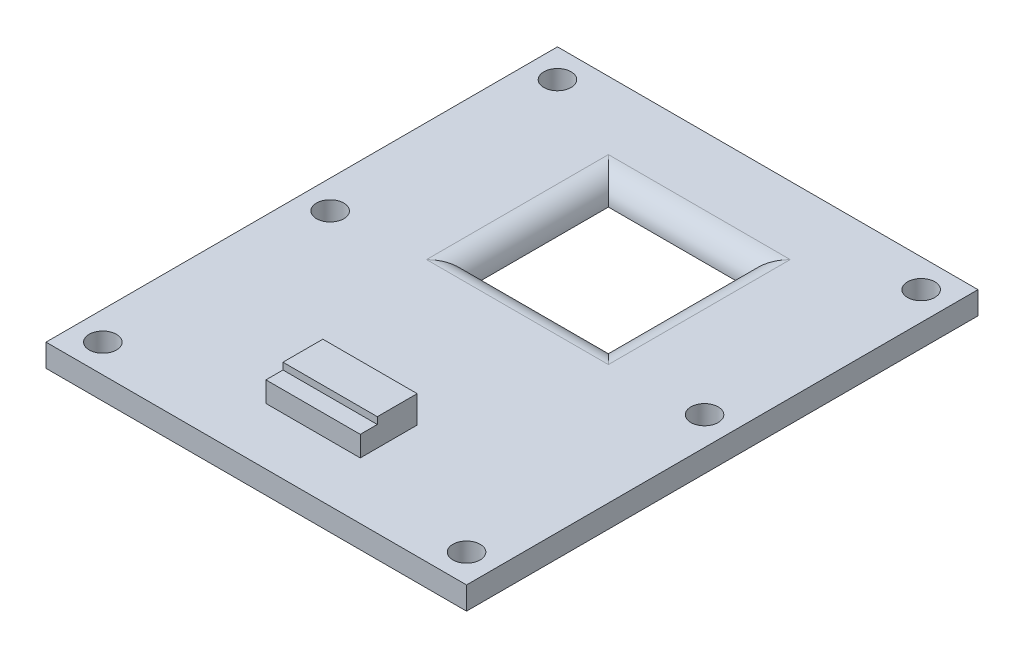
ISO-10303-21;
HEADER;
FILE_DESCRIPTION(('STEP AP214'),'2;1');
FILE_NAME('part.step','',(''),(''),'','','');
FILE_SCHEMA(('AUTOMOTIVE_DESIGN { 1 0 10303 214 1 1 1 1 }'));
ENDSEC;
DATA;
#1=APPLICATION_CONTEXT('core data for automotive mechanical design processes');
#2=APPLICATION_PROTOCOL_DEFINITION('international standard','automotive_design',2000,#1);
#3=PRODUCT_CONTEXT('',#1,'mechanical');
#4=PRODUCT('Part','Part','',(#3));
#5=PRODUCT_RELATED_PRODUCT_CATEGORY('part','',(#4));
#6=PRODUCT_DEFINITION_FORMATION('','',#4);
#7=PRODUCT_DEFINITION_CONTEXT('part definition',#1,'design');
#8=PRODUCT_DEFINITION('design','',#6,#7);
#9=PRODUCT_DEFINITION_SHAPE('','',#8);
#10=(LENGTH_UNIT() NAMED_UNIT(*) SI_UNIT(.MILLI.,.METRE.));
#11=(NAMED_UNIT(*) PLANE_ANGLE_UNIT() SI_UNIT($,.RADIAN.));
#12=(NAMED_UNIT(*) SI_UNIT($,.STERADIAN.) SOLID_ANGLE_UNIT());
#13=UNCERTAINTY_MEASURE_WITH_UNIT(LENGTH_MEASURE(1.E-05),#10,'distance_accuracy_value','');
#14=(GEOMETRIC_REPRESENTATION_CONTEXT(3) GLOBAL_UNCERTAINTY_ASSIGNED_CONTEXT((#13)) GLOBAL_UNIT_ASSIGNED_CONTEXT((#10,
#11,#12)) REPRESENTATION_CONTEXT('',''));
#15=CARTESIAN_POINT('',(0.,0.,0.));
#16=DIRECTION('',(0.,0.,1.));
#17=DIRECTION('',(1.,0.,0.));
#18=AXIS2_PLACEMENT_3D('',#15,#16,#17);
#19=CARTESIAN_POINT('',(0.,2.,0.));
#20=DIRECTION('',(0.,1.,0.));
#21=DIRECTION('',(0.,0.,1.));
#22=AXIS2_PLACEMENT_3D('',#19,#20,#21);
#23=PLANE('',#22);
#24=CARTESIAN_POINT('',(16.9880851622537,2.,-19.0601999668003));
#25=DIRECTION('',(0.,1.,0.));
#26=DIRECTION('',(0.,0.,1.));
#27=AXIS2_PLACEMENT_3D('',#24,#25,#26);
#28=CIRCLE('',#27,1.19999999999999);
#29=CARTESIAN_POINT('',(16.9880851622537,2.,-17.8601999668003));
#30=VERTEX_POINT('',#29);
#31=EDGE_CURVE('E39',#30,#30,#28,.T.);
#32=ORIENTED_EDGE('',*,*,#31,.F.);
#33=EDGE_LOOP('',(#32));
#34=FACE_BOUND('',#33,.T.);
#35=CARTESIAN_POINT('',(-15.0119148377464,2.,-19.0601999668003));
#36=DIRECTION('',(0.,1.,0.));
#37=DIRECTION('',(0.,0.,1.));
#38=AXIS2_PLACEMENT_3D('',#35,#36,#37);
#39=CIRCLE('',#38,1.19999999999999);
#40=CARTESIAN_POINT('',(-15.0119148377464,2.,-17.8601999668003));
#41=VERTEX_POINT('',#40);
#42=EDGE_CURVE('E263',#41,#41,#39,.T.);
#43=ORIENTED_EDGE('',*,*,#42,.F.);
#44=EDGE_LOOP('',(#43));
#45=FACE_BOUND('',#44,.T.);
#46=CARTESIAN_POINT('',(-15.0119148377464,2.,0.939800033199711));
#47=DIRECTION('',(0.,1.,0.));
#48=DIRECTION('',(0.,0.,1.));
#49=AXIS2_PLACEMENT_3D('',#46,#47,#48);
#50=CIRCLE('',#49,1.19999999999999);
#51=CARTESIAN_POINT('',(-15.0119148377464,2.,2.1398000331997));
#52=VERTEX_POINT('',#51);
#53=EDGE_CURVE('E253',#52,#52,#50,.T.);
#54=ORIENTED_EDGE('',*,*,#53,.F.);
#55=EDGE_LOOP('',(#54));
#56=FACE_BOUND('',#55,.T.);
#57=CARTESIAN_POINT('',(-15.0119148377464,2.,20.9398000331997));
#58=DIRECTION('',(0.,1.,0.));
#59=DIRECTION('',(0.,0.,1.));
#60=AXIS2_PLACEMENT_3D('',#57,#58,#59);
#61=CIRCLE('',#60,1.19999999999999);
#62=CARTESIAN_POINT('',(-15.0119148377464,2.,22.1398000331997));
#63=VERTEX_POINT('',#62);
#64=EDGE_CURVE('E260',#63,#63,#61,.T.);
#65=ORIENTED_EDGE('',*,*,#64,.F.);
#66=EDGE_LOOP('',(#65));
#67=FACE_BOUND('',#66,.T.);
#68=CARTESIAN_POINT('',(16.9880851622536,2.,20.9398000331997));
#69=DIRECTION('',(0.,1.,0.));
#70=DIRECTION('',(0.,0.,1.));
#71=AXIS2_PLACEMENT_3D('',#68,#69,#70);
#72=CIRCLE('',#71,1.19999999999999);
#73=CARTESIAN_POINT('',(16.9880851622536,2.,22.1398000331997));
#74=VERTEX_POINT('',#73);
#75=EDGE_CURVE('E249',#74,#74,#72,.T.);
#76=ORIENTED_EDGE('',*,*,#75,.F.);
#77=EDGE_LOOP('',(#76));
#78=FACE_BOUND('',#77,.T.);
#79=CARTESIAN_POINT('',(16.9880851622537,2.,1.8000001142382E-07));
#80=DIRECTION('',(0.,1.,0.));
#81=DIRECTION('',(0.,0.,1.));
#82=AXIS2_PLACEMENT_3D('',#79,#80,#81);
#83=CIRCLE('',#82,1.19999999999999);
#84=CARTESIAN_POINT('',(16.9880851622537,2.,1.20000018));
#85=VERTEX_POINT('',#84);
#86=EDGE_CURVE('E169',#85,#85,#83,.T.);
#87=ORIENTED_EDGE('',*,*,#86,.F.);
#88=EDGE_LOOP('',(#87));
#89=FACE_BOUND('',#88,.T.);
#90=DIRECTION('',(0.,0.,-1.));
#91=VECTOR('',#90,1.);
#92=CARTESIAN_POINT('',(5.13808516225372,2.,18.4398000331997));
#93=LINE('',#92,#91);
#94=CARTESIAN_POINT('',(5.13808516225372,2.,18.4398000331997));
#95=VERTEX_POINT('',#94);
#96=CARTESIAN_POINT('',(5.13808516225372,2.,13.432504968948));
#97=VERTEX_POINT('',#96);
#98=EDGE_CURVE('E207',#95,#97,#93,.T.);
#99=ORIENTED_EDGE('',*,*,#98,.F.);
#100=DIRECTION('',(-1.,0.,0.));
#101=VECTOR('',#100,1.);
#102=CARTESIAN_POINT('',(14.4880851622537,2.,18.4398000331997));
#103=LINE('',#102,#101);
#104=CARTESIAN_POINT('',(-3.16191483774628,2.,18.4398000331997));
#105=VERTEX_POINT('',#104);
#106=EDGE_CURVE('E171',#95,#105,#103,.T.);
#107=ORIENTED_EDGE('',*,*,#106,.T.);
#108=DIRECTION('',(0.,0.,1.));
#109=VECTOR('',#108,1.);
#110=CARTESIAN_POINT('',(-3.16191483774628,2.,18.4398000331997));
#111=LINE('',#110,#109);
#112=CARTESIAN_POINT('',(-3.16191483774628,2.,13.432504968948));
#113=VERTEX_POINT('',#112);
#114=EDGE_CURVE('E187',#113,#105,#111,.T.);
#115=ORIENTED_EDGE('',*,*,#114,.F.);
#116=DIRECTION('',(-1.,0.,0.));
#117=VECTOR('',#116,1.);
#118=CARTESIAN_POINT('',(5.13808516225372,2.,13.432504968948));
#119=LINE('',#118,#117);
#120=EDGE_CURVE('E173',#97,#113,#119,.T.);
#121=ORIENTED_EDGE('',*,*,#120,.F.);
#122=EDGE_LOOP('',(#99,#107,#115,#121));
#123=FACE_BOUND('',#122,.T.);
#124=DIRECTION('',(0.,0.,1.));
#125=VECTOR('',#124,1.);
#126=CARTESIAN_POINT('',(-7.06191483774629,2.,-13.5901999668003));
#127=LINE('',#126,#125);
#128=CARTESIAN_POINT('',(-7.06191483774629,2.,0.409800033199715));
#129=VERTEX_POINT('',#128);
#130=CARTESIAN_POINT('',(-7.06191483774629,2.,-15.5901999668003));
#131=VERTEX_POINT('',#130);
#132=EDGE_CURVE('E237',#129,#131,#127,.F.);
#133=ORIENTED_EDGE('',*,*,#132,.T.);
#134=DIRECTION('',(-1.,0.,0.));
#135=VECTOR('',#134,1.);
#136=CARTESIAN_POINT('',(6.93808516225371,2.,-15.5901999668003));
#137=LINE('',#136,#135);
#138=CARTESIAN_POINT('',(8.93808516225371,2.,-15.5901999668003));
#139=VERTEX_POINT('',#138);
#140=EDGE_CURVE('E11',#131,#139,#137,.F.);
#141=ORIENTED_EDGE('',*,*,#140,.T.);
#142=DIRECTION('',(0.,0.,-1.));
#143=VECTOR('',#142,1.);
#144=CARTESIAN_POINT('',(8.93808516225371,2.,-1.59019996680029));
#145=LINE('',#144,#143);
#146=CARTESIAN_POINT('',(8.93808516225371,2.,0.409800033199713));
#147=VERTEX_POINT('',#146);
#148=EDGE_CURVE('E44',#139,#147,#145,.F.);
#149=ORIENTED_EDGE('',*,*,#148,.T.);
#150=DIRECTION('',(1.,0.,0.));
#151=VECTOR('',#150,1.);
#152=CARTESIAN_POINT('',(-5.06191483774629,2.,0.409800033199715));
#153=LINE('',#152,#151);
#154=EDGE_CURVE('E239',#147,#129,#153,.F.);
#155=ORIENTED_EDGE('',*,*,#154,.T.);
#156=EDGE_LOOP('',(#133,#141,#149,#155));
#157=FACE_BOUND('',#156,.T.);
#158=DIRECTION('',(0.,0.,1.));
#159=VECTOR('',#158,1.);
#160=CARTESIAN_POINT('',(19.4880851622537,2.,-21.5601999668003));
#161=LINE('',#160,#159);
#162=CARTESIAN_POINT('',(19.4880851622537,2.,-21.5601999668003));
#163=VERTEX_POINT('',#162);
#164=CARTESIAN_POINT('',(19.4880851622537,2.,23.4398000331997));
#165=VERTEX_POINT('',#164);
#166=EDGE_CURVE('E167',#163,#165,#161,.T.);
#167=ORIENTED_EDGE('',*,*,#166,.F.);
#168=DIRECTION('',(1.,0.,0.));
#169=VECTOR('',#168,1.);
#170=CARTESIAN_POINT('',(19.4880851622537,2.,-21.5601999668003));
#171=LINE('',#170,#169);
#172=CARTESIAN_POINT('',(-17.5119148377463,2.,-21.5601999668003));
#173=VERTEX_POINT('',#172);
#174=EDGE_CURVE('E143',#173,#163,#171,.T.);
#175=ORIENTED_EDGE('',*,*,#174,.F.);
#176=DIRECTION('',(0.,0.,-1.));
#177=VECTOR('',#176,1.);
#178=CARTESIAN_POINT('',(-17.5119148377463,2.,-21.5601999668003));
#179=LINE('',#178,#177);
#180=CARTESIAN_POINT('',(-17.5119148377463,2.,23.4398000331997));
#181=VERTEX_POINT('',#180);
#182=EDGE_CURVE('E137',#181,#173,#179,.T.);
#183=ORIENTED_EDGE('',*,*,#182,.F.);
#184=DIRECTION('',(-1.,0.,0.));
#185=VECTOR('',#184,1.);
#186=CARTESIAN_POINT('',(19.4880851622537,2.,23.4398000331997));
#187=LINE('',#186,#185);
#188=EDGE_CURVE('E140',#165,#181,#187,.T.);
#189=ORIENTED_EDGE('',*,*,#188,.F.);
#190=EDGE_LOOP('',(#167,#175,#183,#189));
#191=FACE_BOUND('',#190,.T.);
#192=ADVANCED_FACE('F35',(#34,#45,#56,#67,#78,#89,#123,#157,#191),#23,.T.);
#193=CARTESIAN_POINT('',(0.,2.,18.4398000331997));
#194=DIRECTION('',(0.,0.,1.));
#195=DIRECTION('',(1.,0.,0.));
#196=AXIS2_PLACEMENT_3D('',#193,#194,#195);
#197=PLANE('',#196);
#198=ORIENTED_EDGE('',*,*,#106,.F.);
#199=DIRECTION('',(0.,-1.,0.));
#200=VECTOR('',#199,1.);
#201=CARTESIAN_POINT('',(5.13808516225372,3.8,18.4398000331997));
#202=LINE('',#201,#200);
#203=CARTESIAN_POINT('',(5.13808516225372,3.8,18.4398000331997));
#204=VERTEX_POINT('',#203);
#205=EDGE_CURVE('E215',#204,#95,#202,.T.);
#206=ORIENTED_EDGE('',*,*,#205,.F.);
#207=DIRECTION('',(1.,0.,0.));
#208=VECTOR('',#207,1.);
#209=CARTESIAN_POINT('',(-3.16191483774628,3.8,18.4398000331997));
#210=LINE('',#209,#208);
#211=CARTESIAN_POINT('',(-3.16191483774628,3.8,18.4398000331997));
#212=VERTEX_POINT('',#211);
#213=EDGE_CURVE('E206',#212,#204,#210,.T.);
#214=ORIENTED_EDGE('',*,*,#213,.F.);
#215=DIRECTION('',(0.,-1.,0.));
#216=VECTOR('',#215,1.);
#217=CARTESIAN_POINT('',(-3.16191483774628,3.8,18.4398000331997));
#218=LINE('',#217,#216);
#219=EDGE_CURVE('E221',#212,#105,#218,.T.);
#220=ORIENTED_EDGE('',*,*,#219,.T.);
#221=EDGE_LOOP('',(#198,#206,#214,#220));
#222=FACE_BOUND('',#221,.T.);
#223=ADVANCED_FACE('F303',(#222),#197,.T.);
#224=CARTESIAN_POINT('',(0.,0.,0.));
#225=DIRECTION('',(0.,1.,0.));
#226=DIRECTION('',(0.,0.,1.));
#227=AXIS2_PLACEMENT_3D('',#224,#225,#226);
#228=PLANE('',#227);
#229=CARTESIAN_POINT('',(16.9880851622537,0.,-19.0601999668003));
#230=DIRECTION('',(0.,-1.,0.));
#231=DIRECTION('',(0.,0.,-1.));
#232=AXIS2_PLACEMENT_3D('',#229,#230,#231);
#233=CIRCLE('',#232,1.19999999999999);
#234=CARTESIAN_POINT('',(16.9880851622537,0.,-20.2601999668003));
#235=VERTEX_POINT('',#234);
#236=EDGE_CURVE('E546',#235,#235,#233,.T.);
#237=ORIENTED_EDGE('',*,*,#236,.F.);
#238=EDGE_LOOP('',(#237));
#239=FACE_BOUND('',#238,.T.);
#240=CARTESIAN_POINT('',(-15.0119148377464,0.,-19.0601999668003));
#241=DIRECTION('',(0.,-1.,0.));
#242=DIRECTION('',(0.,0.,-1.));
#243=AXIS2_PLACEMENT_3D('',#240,#241,#242);
#244=CIRCLE('',#243,1.19999999999999);
#245=CARTESIAN_POINT('',(-15.0119148377464,0.,-20.2601999668003));
#246=VERTEX_POINT('',#245);
#247=EDGE_CURVE('E268',#246,#246,#244,.T.);
#248=ORIENTED_EDGE('',*,*,#247,.F.);
#249=EDGE_LOOP('',(#248));
#250=FACE_BOUND('',#249,.T.);
#251=CARTESIAN_POINT('',(-15.0119148377464,0.,0.939800033199711));
#252=DIRECTION('',(0.,-1.,0.));
#253=DIRECTION('',(0.,0.,-1.));
#254=AXIS2_PLACEMENT_3D('',#251,#252,#253);
#255=CIRCLE('',#254,1.19999999999999);
#256=CARTESIAN_POINT('',(-15.0119148377464,0.,-0.260199966800276));
#257=VERTEX_POINT('',#256);
#258=EDGE_CURVE('E256',#257,#257,#255,.T.);
#259=ORIENTED_EDGE('',*,*,#258,.F.);
#260=EDGE_LOOP('',(#259));
#261=FACE_BOUND('',#260,.T.);
#262=CARTESIAN_POINT('',(-15.0119148377464,0.,20.9398000331997));
#263=DIRECTION('',(0.,-1.,0.));
#264=DIRECTION('',(0.,0.,-1.));
#265=AXIS2_PLACEMENT_3D('',#262,#263,#264);
#266=CIRCLE('',#265,1.19999999999999);
#267=CARTESIAN_POINT('',(-15.0119148377464,0.,19.7398000331997));
#268=VERTEX_POINT('',#267);
#269=EDGE_CURVE('E255',#268,#268,#266,.T.);
#270=ORIENTED_EDGE('',*,*,#269,.F.);
#271=EDGE_LOOP('',(#270));
#272=FACE_BOUND('',#271,.T.);
#273=CARTESIAN_POINT('',(16.9880851622536,0.,20.9398000331997));
#274=DIRECTION('',(0.,-1.,0.));
#275=DIRECTION('',(0.,0.,-1.));
#276=AXIS2_PLACEMENT_3D('',#273,#274,#275);
#277=CIRCLE('',#276,1.19999999999999);
#278=CARTESIAN_POINT('',(16.9880851622536,0.,19.7398000331997));
#279=VERTEX_POINT('',#278);
#280=EDGE_CURVE('E252',#279,#279,#277,.T.);
#281=ORIENTED_EDGE('',*,*,#280,.F.);
#282=EDGE_LOOP('',(#281));
#283=FACE_BOUND('',#282,.T.);
#284=CARTESIAN_POINT('',(16.9880851622537,0.,1.8000001142382E-07));
#285=DIRECTION('',(0.,-1.,0.));
#286=DIRECTION('',(0.,0.,-1.));
#287=AXIS2_PLACEMENT_3D('',#284,#285,#286);
#288=CIRCLE('',#287,1.19999999999999);
#289=CARTESIAN_POINT('',(16.9880851622537,0.,-1.19999981999997));
#290=VERTEX_POINT('',#289);
#291=EDGE_CURVE('E251',#290,#290,#288,.T.);
#292=ORIENTED_EDGE('',*,*,#291,.F.);
#293=EDGE_LOOP('',(#292));
#294=FACE_BOUND('',#293,.T.);
#295=DIRECTION('',(1.,0.,0.));
#296=VECTOR('',#295,1.);
#297=CARTESIAN_POINT('',(6.93808516225371,0.,-13.5901999668003));
#298=LINE('',#297,#296);
#299=CARTESIAN_POINT('',(-5.06191483774629,0.,-13.5901999668003));
#300=VERTEX_POINT('',#299);
#301=CARTESIAN_POINT('',(6.93808516225371,0.,-13.5901999668003));
#302=VERTEX_POINT('',#301);
#303=EDGE_CURVE('E228',#300,#302,#298,.T.);
#304=ORIENTED_EDGE('',*,*,#303,.F.);
#305=DIRECTION('',(0.,0.,-1.));
#306=VECTOR('',#305,1.);
#307=CARTESIAN_POINT('',(-5.06191483774629,0.,-1.59019996680029));
#308=LINE('',#307,#306);
#309=CARTESIAN_POINT('',(-5.06191483774629,0.,-1.59019996680029));
#310=VERTEX_POINT('',#309);
#311=EDGE_CURVE('E231',#310,#300,#308,.T.);
#312=ORIENTED_EDGE('',*,*,#311,.F.);
#313=DIRECTION('',(-1.,0.,0.));
#314=VECTOR('',#313,1.);
#315=CARTESIAN_POINT('',(6.93808516225371,0.,-1.59019996680029));
#316=LINE('',#315,#314);
#317=CARTESIAN_POINT('',(6.93808516225371,0.,-1.59019996680029));
#318=VERTEX_POINT('',#317);
#319=EDGE_CURVE('E234',#318,#310,#316,.T.);
#320=ORIENTED_EDGE('',*,*,#319,.F.);
#321=DIRECTION('',(0.,0.,1.));
#322=VECTOR('',#321,1.);
#323=CARTESIAN_POINT('',(6.93808516225371,0.,-1.59019996680029));
#324=LINE('',#323,#322);
#325=EDGE_CURVE('E225',#302,#318,#324,.T.);
#326=ORIENTED_EDGE('',*,*,#325,.F.);
#327=EDGE_LOOP('',(#304,#312,#320,#326));
#328=FACE_BOUND('',#327,.T.);
#329=DIRECTION('',(0.,0.,1.));
#330=VECTOR('',#329,1.);
#331=CARTESIAN_POINT('',(19.4880851622537,0.,-21.5601999668003));
#332=LINE('',#331,#330);
#333=CARTESIAN_POINT('',(19.4880851622537,0.,-21.5601999668003));
#334=VERTEX_POINT('',#333);
#335=CARTESIAN_POINT('',(19.4880851622537,0.,23.4398000331997));
#336=VERTEX_POINT('',#335);
#337=EDGE_CURVE('E157',#334,#336,#332,.T.);
#338=ORIENTED_EDGE('',*,*,#337,.T.);
#339=DIRECTION('',(-1.,0.,0.));
#340=VECTOR('',#339,1.);
#341=CARTESIAN_POINT('',(19.4880851622537,0.,23.4398000331997));
#342=LINE('',#341,#340);
#343=CARTESIAN_POINT('',(-17.5119148377463,0.,23.4398000331997));
#344=VERTEX_POINT('',#343);
#345=EDGE_CURVE('E282',#336,#344,#342,.T.);
#346=ORIENTED_EDGE('',*,*,#345,.T.);
#347=DIRECTION('',(0.,0.,-1.));
#348=VECTOR('',#347,1.);
#349=CARTESIAN_POINT('',(-17.5119148377463,0.,-21.5601999668003));
#350=LINE('',#349,#348);
#351=CARTESIAN_POINT('',(-17.5119148377463,0.,-21.5601999668003));
#352=VERTEX_POINT('',#351);
#353=EDGE_CURVE('E153',#344,#352,#350,.T.);
#354=ORIENTED_EDGE('',*,*,#353,.T.);
#355=DIRECTION('',(1.,0.,0.));
#356=VECTOR('',#355,1.);
#357=CARTESIAN_POINT('',(19.4880851622537,0.,-21.5601999668003));
#358=LINE('',#357,#356);
#359=EDGE_CURVE('E174',#352,#334,#358,.T.);
#360=ORIENTED_EDGE('',*,*,#359,.T.);
#361=EDGE_LOOP('',(#338,#346,#354,#360));
#362=FACE_BOUND('',#361,.T.);
#363=ADVANCED_FACE('F286',(#239,#250,#261,#272,#283,#294,#328,#362),#228,.F.);
#364=CARTESIAN_POINT('',(6.93808516225371,0.,0.409800033199713));
#365=DIRECTION('',(-1.,0.,0.));
#366=DIRECTION('',(0.,0.,1.));
#367=AXIS2_PLACEMENT_3D('',#364,#365,#366);
#368=CYLINDRICAL_SURFACE('',#367,2.);
#369=CARTESIAN_POINT('',(-7.06191483774629,0.,0.409800033199715));
#370=DIRECTION('',(-0.707106781186548,0.,-0.707106781186547));
#371=DIRECTION('',(-0.707106781186547,0.,0.707106781186548));
#372=AXIS2_PLACEMENT_3D('',#369,#370,#371);
#373=ELLIPSE('',#372,2.82842712474619,2.);
#374=EDGE_CURVE('E244',#129,#310,#373,.T.);
#375=ORIENTED_EDGE('',*,*,#374,.F.);
#376=ORIENTED_EDGE('',*,*,#154,.F.);
#377=CARTESIAN_POINT('',(8.93808516225371,0.,0.409800033199713));
#378=DIRECTION('',(-0.707106781186547,0.,0.707106781186548));
#379=DIRECTION('',(0.707106781186548,0.,0.707106781186547));
#380=AXIS2_PLACEMENT_3D('',#377,#378,#379);
#381=ELLIPSE('',#380,2.82842712474619,2.);
#382=EDGE_CURVE('E229',#318,#147,#381,.F.);
#383=ORIENTED_EDGE('',*,*,#382,.F.);
#384=ORIENTED_EDGE('',*,*,#319,.T.);
#385=EDGE_LOOP('',(#375,#376,#383,#384));
#386=FACE_BOUND('',#385,.T.);
#387=ADVANCED_FACE('F37',(#386),#368,.T.);
#388=CARTESIAN_POINT('',(8.93808516225371,0.,-1.59019996680029));
#389=DIRECTION('',(0.,0.,1.));
#390=DIRECTION('',(1.,0.,0.));
#391=AXIS2_PLACEMENT_3D('',#388,#389,#390);
#392=CYLINDRICAL_SURFACE('',#391,2.);
#393=ORIENTED_EDGE('',*,*,#382,.T.);
#394=ORIENTED_EDGE('',*,*,#148,.F.);
#395=CARTESIAN_POINT('',(8.93808516225371,0.,-15.5901999668003));
#396=DIRECTION('',(0.707106781186548,0.,0.707106781186547));
#397=DIRECTION('',(0.707106781186547,0.,-0.707106781186548));
#398=AXIS2_PLACEMENT_3D('',#395,#396,#397);
#399=ELLIPSE('',#398,2.82842712474619,2.);
#400=EDGE_CURVE('E52',#302,#139,#399,.F.);
#401=ORIENTED_EDGE('',*,*,#400,.F.);
#402=ORIENTED_EDGE('',*,*,#325,.T.);
#403=EDGE_LOOP('',(#393,#394,#401,#402));
#404=FACE_BOUND('',#403,.T.);
#405=ADVANCED_FACE('F325',(#404),#392,.T.);
#406=CARTESIAN_POINT('',(-7.06191483774629,0.,-1.59019996680029));
#407=DIRECTION('',(0.,0.,-1.));
#408=DIRECTION('',(-1.,0.,0.));
#409=AXIS2_PLACEMENT_3D('',#406,#407,#408);
#410=CYLINDRICAL_SURFACE('',#409,2.);
#411=ORIENTED_EDGE('',*,*,#374,.T.);
#412=ORIENTED_EDGE('',*,*,#311,.T.);
#413=CARTESIAN_POINT('',(-7.06191483774629,0.,-15.5901999668003));
#414=DIRECTION('',(0.707106781186547,0.,-0.707106781186548));
#415=DIRECTION('',(0.707106781186548,0.,0.707106781186547));
#416=AXIS2_PLACEMENT_3D('',#413,#414,#415);
#417=ELLIPSE('',#416,2.82842712474619,2.);
#418=EDGE_CURVE('E224',#131,#300,#417,.T.);
#419=ORIENTED_EDGE('',*,*,#418,.F.);
#420=ORIENTED_EDGE('',*,*,#132,.F.);
#421=EDGE_LOOP('',(#411,#412,#419,#420));
#422=FACE_BOUND('',#421,.T.);
#423=ADVANCED_FACE('F323',(#422),#410,.T.);
#424=CARTESIAN_POINT('',(6.93808516225371,0.,-15.5901999668003));
#425=DIRECTION('',(1.,0.,0.));
#426=DIRECTION('',(0.,0.,-1.));
#427=AXIS2_PLACEMENT_3D('',#424,#425,#426);
#428=CYLINDRICAL_SURFACE('',#427,2.);
#429=ORIENTED_EDGE('',*,*,#400,.T.);
#430=ORIENTED_EDGE('',*,*,#140,.F.);
#431=ORIENTED_EDGE('',*,*,#418,.T.);
#432=ORIENTED_EDGE('',*,*,#303,.T.);
#433=EDGE_LOOP('',(#429,#430,#431,#432));
#434=FACE_BOUND('',#433,.T.);
#435=ADVANCED_FACE('F320',(#434),#428,.T.);
#436=CARTESIAN_POINT('',(-3.16191483774628,3.8,18.4398000331997));
#437=DIRECTION('',(1.,0.,0.));
#438=DIRECTION('',(0.,0.,-1.));
#439=AXIS2_PLACEMENT_3D('',#436,#437,#438);
#440=PLANE('',#439);
#441=ORIENTED_EDGE('',*,*,#114,.T.);
#442=ORIENTED_EDGE('',*,*,#219,.F.);
#443=DIRECTION('',(0.,0.,1.));
#444=VECTOR('',#443,1.);
#445=CARTESIAN_POINT('',(-3.16191483774628,3.8,18.4398000331997));
#446=LINE('',#445,#444);
#447=CARTESIAN_POINT('',(-3.16191483774628,3.8,16.9398000331997));
#448=VERTEX_POINT('',#447);
#449=EDGE_CURVE('E203',#448,#212,#446,.T.);
#450=ORIENTED_EDGE('',*,*,#449,.F.);
#451=DIRECTION('',(0.,-1.,0.));
#452=VECTOR('',#451,1.);
#453=CARTESIAN_POINT('',(-3.16191483774628,13.4062307603103,16.9398000331997));
#454=LINE('',#453,#452);
#455=CARTESIAN_POINT('',(-3.16191483774628,4.39561938891506,16.9398000331997));
#456=VERTEX_POINT('',#455);
#457=EDGE_CURVE('E193',#456,#448,#454,.T.);
#458=ORIENTED_EDGE('',*,*,#457,.F.);
#459=DIRECTION('',(0.,-4.3711409E-08,-0.999999999999999));
#460=VECTOR('',#459,1.);
#461=CARTESIAN_POINT('',(-3.16191483774628,4.3956193889151,16.9398004270662));
#462=LINE('',#461,#460);
#463=CARTESIAN_POINT('',(-3.16191483774628,4.39561923560628,13.432504968948));
#464=VERTEX_POINT('',#463);
#465=EDGE_CURVE('E177',#456,#464,#462,.T.);
#466=ORIENTED_EDGE('',*,*,#465,.T.);
#467=DIRECTION('',(0.,-1.,0.));
#468=VECTOR('',#467,1.);
#469=CARTESIAN_POINT('',(-3.16191483774628,13.4062307603103,13.432504968948));
#470=LINE('',#469,#468);
#471=EDGE_CURVE('E195',#464,#113,#470,.T.);
#472=ORIENTED_EDGE('',*,*,#471,.T.);
#473=EDGE_LOOP('',(#441,#442,#450,#458,#466,#472));
#474=FACE_BOUND('',#473,.T.);
#475=ADVANCED_FACE('F315',(#474),#440,.F.);
#476=CARTESIAN_POINT('',(5.13808516225372,3.8,18.4398000331997));
#477=DIRECTION('',(-1.,0.,0.));
#478=DIRECTION('',(0.,0.,1.));
#479=AXIS2_PLACEMENT_3D('',#476,#477,#478);
#480=PLANE('',#479);
#481=ORIENTED_EDGE('',*,*,#98,.T.);
#482=DIRECTION('',(0.,-1.,0.));
#483=VECTOR('',#482,1.);
#484=CARTESIAN_POINT('',(5.13808516225372,13.4062307603103,13.432504968948));
#485=LINE('',#484,#483);
#486=CARTESIAN_POINT('',(5.13808516225372,4.39561923560622,13.432504968948));
#487=VERTEX_POINT('',#486);
#488=EDGE_CURVE('E198',#487,#97,#485,.T.);
#489=ORIENTED_EDGE('',*,*,#488,.F.);
#490=DIRECTION('',(0.,4.3711409E-08,0.999999999999999));
#491=VECTOR('',#490,1.);
#492=CARTESIAN_POINT('',(5.13808516225372,4.39561938891505,16.9398004270662));
#493=LINE('',#492,#491);
#494=CARTESIAN_POINT('',(5.13808516225372,4.39561938891503,16.9398000331997));
#495=VERTEX_POINT('',#494);
#496=EDGE_CURVE('E184',#487,#495,#493,.T.);
#497=ORIENTED_EDGE('',*,*,#496,.T.);
#498=DIRECTION('',(0.,-1.,0.));
#499=VECTOR('',#498,1.);
#500=CARTESIAN_POINT('',(5.13808516225372,13.4062307603103,16.9398000331997));
#501=LINE('',#500,#499);
#502=CARTESIAN_POINT('',(5.13808516225372,3.8,16.9398000331997));
#503=VERTEX_POINT('',#502);
#504=EDGE_CURVE('E190',#495,#503,#501,.T.);
#505=ORIENTED_EDGE('',*,*,#504,.T.);
#506=DIRECTION('',(0.,0.,-1.));
#507=VECTOR('',#506,1.);
#508=CARTESIAN_POINT('',(5.13808516225372,3.8,18.4398000331997));
#509=LINE('',#508,#507);
#510=EDGE_CURVE('E209',#204,#503,#509,.T.);
#511=ORIENTED_EDGE('',*,*,#510,.F.);
#512=ORIENTED_EDGE('',*,*,#205,.T.);
#513=EDGE_LOOP('',(#481,#489,#497,#505,#511,#512));
#514=FACE_BOUND('',#513,.T.);
#515=ADVANCED_FACE('F367',(#514),#480,.F.);
#516=CARTESIAN_POINT('',(0.,3.8,0.));
#517=DIRECTION('',(0.,-1.,0.));
#518=DIRECTION('',(0.,0.,-1.));
#519=AXIS2_PLACEMENT_3D('',#516,#517,#518);
#520=PLANE('',#519);
#521=ORIENTED_EDGE('',*,*,#449,.T.);
#522=ORIENTED_EDGE('',*,*,#213,.T.);
#523=ORIENTED_EDGE('',*,*,#510,.T.);
#524=DIRECTION('',(-1.,0.,0.));
#525=VECTOR('',#524,1.);
#526=CARTESIAN_POINT('',(-3.16191483774628,3.8,16.9398000331997));
#527=LINE('',#526,#525);
#528=EDGE_CURVE('E212',#503,#448,#527,.T.);
#529=ORIENTED_EDGE('',*,*,#528,.T.);
#530=EDGE_LOOP('',(#521,#522,#523,#529));
#531=FACE_BOUND('',#530,.T.);
#532=ADVANCED_FACE('F377',(#531),#520,.F.);
#533=CARTESIAN_POINT('',(5.13808516225372,13.4062307603103,16.9398000331997));
#534=DIRECTION('',(0.,0.,-1.));
#535=DIRECTION('',(-1.,0.,0.));
#536=AXIS2_PLACEMENT_3D('',#533,#534,#535);
#537=PLANE('',#536);
#538=ORIENTED_EDGE('',*,*,#457,.T.);
#539=ORIENTED_EDGE('',*,*,#528,.F.);
#540=ORIENTED_EDGE('',*,*,#504,.F.);
#541=DIRECTION('',(-1.,0.,0.));
#542=VECTOR('',#541,1.);
#543=CARTESIAN_POINT('',(5.13808516225365,4.39561938891503,16.9398000331997));
#544=LINE('',#543,#542);
#545=EDGE_CURVE('E181',#495,#456,#544,.T.);
#546=ORIENTED_EDGE('',*,*,#545,.T.);
#547=EDGE_LOOP('',(#538,#539,#540,#546));
#548=FACE_BOUND('',#547,.T.);
#549=ADVANCED_FACE('F447',(#548),#537,.F.);
#550=CARTESIAN_POINT('',(5.13808516225372,13.4062307603103,13.432504968948));
#551=DIRECTION('',(0.,0.,1.));
#552=DIRECTION('',(1.,0.,0.));
#553=AXIS2_PLACEMENT_3D('',#550,#551,#552);
#554=PLANE('',#553);
#555=ORIENTED_EDGE('',*,*,#471,.F.);
#556=DIRECTION('',(1.,0.,0.));
#557=VECTOR('',#556,1.);
#558=CARTESIAN_POINT('',(5.13808516225365,4.39561923560622,13.432504968948));
#559=LINE('',#558,#557);
#560=EDGE_CURVE('E180',#464,#487,#559,.T.);
#561=ORIENTED_EDGE('',*,*,#560,.T.);
#562=ORIENTED_EDGE('',*,*,#488,.T.);
#563=ORIENTED_EDGE('',*,*,#120,.T.);
#564=EDGE_LOOP('',(#555,#561,#562,#563));
#565=FACE_BOUND('',#564,.T.);
#566=ADVANCED_FACE('F455',(#565),#554,.F.);
#567=CARTESIAN_POINT('',(4.31901048487058,4.39561942356528,17.732504969056));
#568=DIRECTION('',(0.,-0.999999999999999,4.3711409E-08));
#569=DIRECTION('',(-1.,0.,0.));
#570=AXIS2_PLACEMENT_3D('',#567,#568,#569);
#571=PLANE('',#570);
#572=ORIENTED_EDGE('',*,*,#560,.F.);
#573=ORIENTED_EDGE('',*,*,#465,.F.);
#574=ORIENTED_EDGE('',*,*,#545,.F.);
#575=ORIENTED_EDGE('',*,*,#496,.F.);
#576=EDGE_LOOP('',(#572,#573,#574,#575));
#577=FACE_BOUND('',#576,.T.);
#578=ADVANCED_FACE('F300',(#577),#571,.F.);
#579=CARTESIAN_POINT('',(19.4880851622537,60.258046654518,-21.5601999668003));
#580=DIRECTION('',(1.,0.,0.));
#581=DIRECTION('',(0.,0.,-1.));
#582=AXIS2_PLACEMENT_3D('',#579,#580,#581);
#583=PLANE('',#582);
#584=DIRECTION('',(0.,-1.,0.));
#585=VECTOR('',#584,1.);
#586=CARTESIAN_POINT('',(19.4880851622537,60.258046654518,-21.5601999668003));
#587=LINE('',#586,#585);
#588=EDGE_CURVE('E147',#163,#334,#587,.T.);
#589=ORIENTED_EDGE('',*,*,#588,.F.);
#590=ORIENTED_EDGE('',*,*,#166,.T.);
#591=DIRECTION('',(0.,-1.,0.));
#592=VECTOR('',#591,1.);
#593=CARTESIAN_POINT('',(19.4880851622537,60.258046654518,23.4398000331997));
#594=LINE('',#593,#592);
#595=EDGE_CURVE('E161',#165,#336,#594,.T.);
#596=ORIENTED_EDGE('',*,*,#595,.T.);
#597=ORIENTED_EDGE('',*,*,#337,.F.);
#598=EDGE_LOOP('',(#589,#590,#596,#597));
#599=FACE_BOUND('',#598,.T.);
#600=ADVANCED_FACE('F290',(#599),#583,.T.);
#601=CARTESIAN_POINT('',(19.4880851622537,60.258046654518,-21.5601999668003));
#602=DIRECTION('',(0.,0.,-1.));
#603=DIRECTION('',(-1.,0.,0.));
#604=AXIS2_PLACEMENT_3D('',#601,#602,#603);
#605=PLANE('',#604);
#606=DIRECTION('',(0.,-1.,0.));
#607=VECTOR('',#606,1.);
#608=CARTESIAN_POINT('',(-17.5119148377463,60.258046654518,-21.5601999668003));
#609=LINE('',#608,#607);
#610=EDGE_CURVE('E146',#173,#352,#609,.T.);
#611=ORIENTED_EDGE('',*,*,#610,.F.);
#612=ORIENTED_EDGE('',*,*,#174,.T.);
#613=ORIENTED_EDGE('',*,*,#588,.T.);
#614=ORIENTED_EDGE('',*,*,#359,.F.);
#615=EDGE_LOOP('',(#611,#612,#613,#614));
#616=FACE_BOUND('',#615,.T.);
#617=ADVANCED_FACE('F292',(#616),#605,.T.);
#618=CARTESIAN_POINT('',(-17.5119148377463,60.258046654518,-21.5601999668003));
#619=DIRECTION('',(-1.,0.,0.));
#620=DIRECTION('',(0.,0.,1.));
#621=AXIS2_PLACEMENT_3D('',#618,#619,#620);
#622=PLANE('',#621);
#623=DIRECTION('',(0.,-1.,0.));
#624=VECTOR('',#623,1.);
#625=CARTESIAN_POINT('',(-17.5119148377463,60.258046654518,23.4398000331997));
#626=LINE('',#625,#624);
#627=EDGE_CURVE('E150',#181,#344,#626,.T.);
#628=ORIENTED_EDGE('',*,*,#627,.F.);
#629=ORIENTED_EDGE('',*,*,#182,.T.);
#630=ORIENTED_EDGE('',*,*,#610,.T.);
#631=ORIENTED_EDGE('',*,*,#353,.F.);
#632=EDGE_LOOP('',(#628,#629,#630,#631));
#633=FACE_BOUND('',#632,.T.);
#634=ADVANCED_FACE('F151',(#633),#622,.T.);
#635=CARTESIAN_POINT('',(19.4880851622537,60.258046654518,23.4398000331997));
#636=DIRECTION('',(0.,0.,1.));
#637=DIRECTION('',(1.,0.,0.));
#638=AXIS2_PLACEMENT_3D('',#635,#636,#637);
#639=PLANE('',#638);
#640=ORIENTED_EDGE('',*,*,#595,.F.);
#641=ORIENTED_EDGE('',*,*,#188,.T.);
#642=ORIENTED_EDGE('',*,*,#627,.T.);
#643=ORIENTED_EDGE('',*,*,#345,.F.);
#644=EDGE_LOOP('',(#640,#641,#642,#643));
#645=FACE_BOUND('',#644,.T.);
#646=ADVANCED_FACE('F160',(#645),#639,.T.);
#647=CARTESIAN_POINT('',(16.9880851622537,0.,1.8000001142382E-07));
#648=DIRECTION('',(0.,-1.,0.));
#649=DIRECTION('',(0.,0.,-1.));
#650=AXIS2_PLACEMENT_3D('',#647,#648,#649);
#651=CYLINDRICAL_SURFACE('',#650,1.19999999999999);
#652=ORIENTED_EDGE('',*,*,#86,.T.);
#653=EDGE_LOOP('',(#652));
#654=FACE_BOUND('',#653,.T.);
#655=ORIENTED_EDGE('',*,*,#291,.T.);
#656=EDGE_LOOP('',(#655));
#657=FACE_BOUND('',#656,.T.);
#658=ADVANCED_FACE('F404',(#654,#657),#651,.F.);
#659=CARTESIAN_POINT('',(16.9880851622536,0.,20.9398000331997));
#660=DIRECTION('',(0.,-1.,0.));
#661=DIRECTION('',(0.,0.,-1.));
#662=AXIS2_PLACEMENT_3D('',#659,#660,#661);
#663=CYLINDRICAL_SURFACE('',#662,1.19999999999999);
#664=ORIENTED_EDGE('',*,*,#75,.T.);
#665=EDGE_LOOP('',(#664));
#666=FACE_BOUND('',#665,.T.);
#667=ORIENTED_EDGE('',*,*,#280,.T.);
#668=EDGE_LOOP('',(#667));
#669=FACE_BOUND('',#668,.T.);
#670=ADVANCED_FACE('F489',(#666,#669),#663,.F.);
#671=CARTESIAN_POINT('',(-15.0119148377464,0.,20.9398000331997));
#672=DIRECTION('',(0.,-1.,0.));
#673=DIRECTION('',(0.,0.,-1.));
#674=AXIS2_PLACEMENT_3D('',#671,#672,#673);
#675=CYLINDRICAL_SURFACE('',#674,1.19999999999999);
#676=ORIENTED_EDGE('',*,*,#64,.T.);
#677=EDGE_LOOP('',(#676));
#678=FACE_BOUND('',#677,.T.);
#679=ORIENTED_EDGE('',*,*,#269,.T.);
#680=EDGE_LOOP('',(#679));
#681=FACE_BOUND('',#680,.T.);
#682=ADVANCED_FACE('F496',(#678,#681),#675,.F.);
#683=CARTESIAN_POINT('',(-15.0119148377464,0.,0.939800033199711));
#684=DIRECTION('',(0.,-1.,0.));
#685=DIRECTION('',(0.,0.,-1.));
#686=AXIS2_PLACEMENT_3D('',#683,#684,#685);
#687=CYLINDRICAL_SURFACE('',#686,1.19999999999999);
#688=ORIENTED_EDGE('',*,*,#53,.T.);
#689=EDGE_LOOP('',(#688));
#690=FACE_BOUND('',#689,.T.);
#691=ORIENTED_EDGE('',*,*,#258,.T.);
#692=EDGE_LOOP('',(#691));
#693=FACE_BOUND('',#692,.T.);
#694=ADVANCED_FACE('F504',(#690,#693),#687,.F.);
#695=CARTESIAN_POINT('',(-15.0119148377464,0.,-19.0601999668003));
#696=DIRECTION('',(0.,-1.,0.));
#697=DIRECTION('',(0.,0.,-1.));
#698=AXIS2_PLACEMENT_3D('',#695,#696,#697);
#699=CYLINDRICAL_SURFACE('',#698,1.19999999999999);
#700=ORIENTED_EDGE('',*,*,#42,.T.);
#701=EDGE_LOOP('',(#700));
#702=FACE_BOUND('',#701,.T.);
#703=ORIENTED_EDGE('',*,*,#247,.T.);
#704=EDGE_LOOP('',(#703));
#705=FACE_BOUND('',#704,.T.);
#706=ADVANCED_FACE('F512',(#702,#705),#699,.F.);
#707=CARTESIAN_POINT('',(16.9880851622537,0.,-19.0601999668003));
#708=DIRECTION('',(0.,-1.,0.));
#709=DIRECTION('',(0.,0.,-1.));
#710=AXIS2_PLACEMENT_3D('',#707,#708,#709);
#711=CYLINDRICAL_SURFACE('',#710,1.19999999999999);
#712=ORIENTED_EDGE('',*,*,#31,.T.);
#713=EDGE_LOOP('',(#712));
#714=FACE_BOUND('',#713,.T.);
#715=ORIENTED_EDGE('',*,*,#236,.T.);
#716=EDGE_LOOP('',(#715));
#717=FACE_BOUND('',#716,.T.);
#718=ADVANCED_FACE('F519',(#714,#717),#711,.F.);
#719=CLOSED_SHELL('',(#192,#223,#363,#387,#405,#423,#435,#475,#515,#532,#549,#566,#578,#600,
#617,#634,#646,#658,#670,#682,#694,#706,#718));
#720=MANIFOLD_SOLID_BREP('B2',#719);
#721=ADVANCED_BREP_SHAPE_REPRESENTATION('',(#18,#720),#14);
#722=SHAPE_DEFINITION_REPRESENTATION(#9,#721);
ENDSEC;
END-ISO-10303-21;
